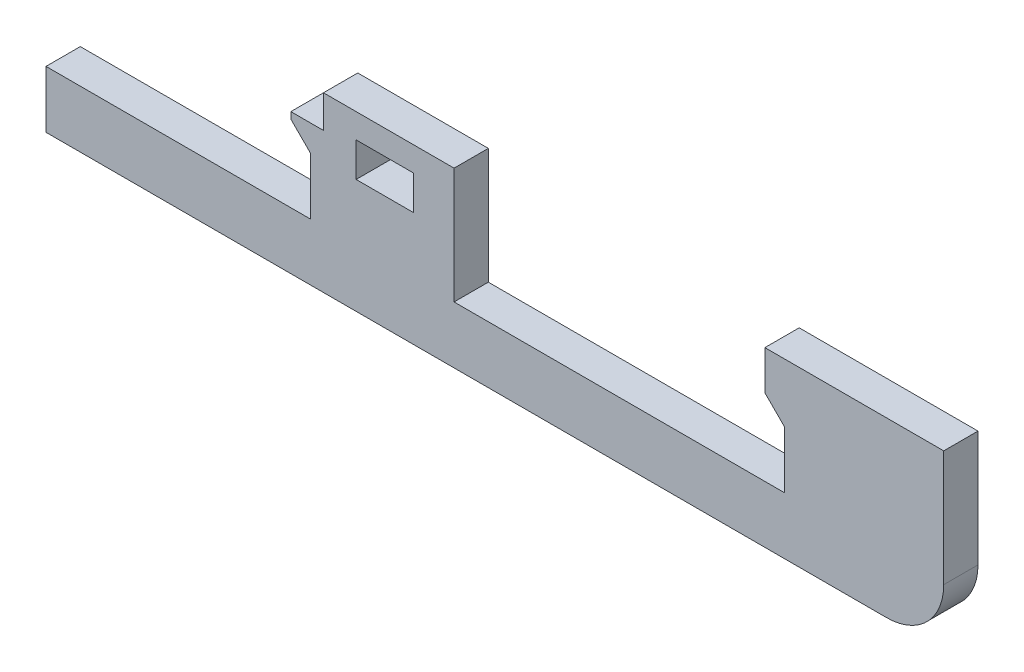
ISO-10303-21;
HEADER;
FILE_DESCRIPTION(('STEP AP214'),'2;1');
FILE_NAME('part.step','',(''),(''),'','','');
FILE_SCHEMA(('AUTOMOTIVE_DESIGN { 1 0 10303 214 1 1 1 1 }'));
ENDSEC;
DATA;
#1=APPLICATION_CONTEXT('core data for automotive mechanical design processes');
#2=APPLICATION_PROTOCOL_DEFINITION('international standard','automotive_design',2000,#1);
#3=PRODUCT_CONTEXT('',#1,'mechanical');
#4=PRODUCT('Part','Part','',(#3));
#5=PRODUCT_RELATED_PRODUCT_CATEGORY('part','',(#4));
#6=PRODUCT_DEFINITION_FORMATION('','',#4);
#7=PRODUCT_DEFINITION_CONTEXT('part definition',#1,'design');
#8=PRODUCT_DEFINITION('design','',#6,#7);
#9=PRODUCT_DEFINITION_SHAPE('','',#8);
#10=(LENGTH_UNIT() NAMED_UNIT(*) SI_UNIT(.MILLI.,.METRE.));
#11=(NAMED_UNIT(*) PLANE_ANGLE_UNIT() SI_UNIT($,.RADIAN.));
#12=(NAMED_UNIT(*) SI_UNIT($,.STERADIAN.) SOLID_ANGLE_UNIT());
#13=UNCERTAINTY_MEASURE_WITH_UNIT(LENGTH_MEASURE(1.E-05),#10,'distance_accuracy_value','');
#14=(GEOMETRIC_REPRESENTATION_CONTEXT(3) GLOBAL_UNCERTAINTY_ASSIGNED_CONTEXT((#13)) GLOBAL_UNIT_ASSIGNED_CONTEXT((#10,
#11,#12)) REPRESENTATION_CONTEXT('',''));
#15=CARTESIAN_POINT('',(0.,0.,0.));
#16=DIRECTION('',(0.,0.,1.));
#17=DIRECTION('',(1.,0.,0.));
#18=AXIS2_PLACEMENT_3D('',#15,#16,#17);
#19=CARTESIAN_POINT('',(0.,0.,5.334));
#20=DIRECTION('',(0.,0.,1.));
#21=DIRECTION('',(1.,0.,0.));
#22=AXIS2_PLACEMENT_3D('',#19,#20,#21);
#23=PLANE('',#22);
#24=DIRECTION('',(0.,1.,0.));
#25=VECTOR('',#24,1.);
#26=CARTESIAN_POINT('',(19.4203051139397,9.6947046579564,5.334));
#27=LINE('',#26,#25);
#28=CARTESIAN_POINT('',(19.4203051139397,9.6947046579564,5.334));
#29=VERTEX_POINT('',#28);
#30=CARTESIAN_POINT('',(19.4203051139397,15.0287046579564,5.334));
#31=VERTEX_POINT('',#30);
#32=EDGE_CURVE('E50',#29,#31,#27,.T.);
#33=ORIENTED_EDGE('',*,*,#32,.F.);
#34=DIRECTION('',(1.,0.,0.));
#35=VECTOR('',#34,1.);
#36=CARTESIAN_POINT('',(19.4203051139397,9.6947046579564,5.334));
#37=LINE('',#36,#35);
#38=CARTESIAN_POINT('',(10.5303051139397,9.6947046579564,5.334));
#39=VERTEX_POINT('',#38);
#40=EDGE_CURVE('E235',#39,#29,#37,.T.);
#41=ORIENTED_EDGE('',*,*,#40,.F.);
#42=DIRECTION('',(0.,-1.,0.));
#43=VECTOR('',#42,1.);
#44=CARTESIAN_POINT('',(10.5303051139397,9.6947046579564,5.334));
#45=LINE('',#44,#43);
#46=CARTESIAN_POINT('',(10.5303051139397,15.0287046579564,5.334));
#47=VERTEX_POINT('',#46);
#48=EDGE_CURVE('E247',#47,#39,#45,.T.);
#49=ORIENTED_EDGE('',*,*,#48,.F.);
#50=DIRECTION('',(-1.,0.,0.));
#51=VECTOR('',#50,1.);
#52=CARTESIAN_POINT('',(19.4203051139397,15.0287046579564,5.334));
#53=LINE('',#52,#51);
#54=EDGE_CURVE('E244',#31,#47,#53,.T.);
#55=ORIENTED_EDGE('',*,*,#54,.F.);
#56=EDGE_LOOP('',(#33,#41,#49,#55));
#57=FACE_BOUND('',#56,.T.);
#58=DIRECTION('',(0.,1.,0.));
#59=VECTOR('',#58,1.);
#60=CARTESIAN_POINT('',(3.41830511393973,4.36070465795646,5.334));
#61=LINE('',#60,#59);
#62=CARTESIAN_POINT('',(3.41830511393973,0.804704657955502,5.334));
#63=VERTEX_POINT('',#62);
#64=CARTESIAN_POINT('',(3.41830511393973,9.69470465795643,5.334));
#65=VERTEX_POINT('',#64);
#66=EDGE_CURVE('E191',#63,#65,#61,.T.);
#67=ORIENTED_EDGE('',*,*,#66,.F.);
#68=DIRECTION('',(1.,0.,0.));
#69=VECTOR('',#68,1.);
#70=CARTESIAN_POINT('',(-37.7296948860603,0.804704657955502,5.334));
#71=LINE('',#70,#69);
#72=CARTESIAN_POINT('',(-37.7296948860603,0.804704657955502,5.334));
#73=VERTEX_POINT('',#72);
#74=EDGE_CURVE('E177',#73,#63,#71,.T.);
#75=ORIENTED_EDGE('',*,*,#74,.F.);
#76=DIRECTION('',(0.,-1.,0.));
#77=VECTOR('',#76,1.);
#78=CARTESIAN_POINT('',(-37.7296948860603,18.8387046579555,5.334));
#79=LINE('',#78,#77);
#80=CARTESIAN_POINT('',(-37.7296948860603,-8.0852953420445,5.334));
#81=VERTEX_POINT('',#80);
#82=EDGE_CURVE('E305',#73,#81,#79,.T.);
#83=ORIENTED_EDGE('',*,*,#82,.T.);
#84=DIRECTION('',(1.,0.,0.));
#85=VECTOR('',#84,1.);
#86=CARTESIAN_POINT('',(-37.7296948860603,-8.0852953420445,5.334));
#87=LINE('',#86,#85);
#88=CARTESIAN_POINT('',(93.0803051139397,-8.0852953420445,5.334));
#89=VERTEX_POINT('',#88);
#90=EDGE_CURVE('E307',#81,#89,#87,.T.);
#91=ORIENTED_EDGE('',*,*,#90,.T.);
#92=CARTESIAN_POINT('',(93.0803051139397,0.804704657955502,5.334));
#93=DIRECTION('',(0.,0.,1.));
#94=DIRECTION('',(1.,0.,0.));
#95=AXIS2_PLACEMENT_3D('',#92,#93,#94);
#96=CIRCLE('',#95,8.89);
#97=CARTESIAN_POINT('',(101.97030511394,0.804704657955506,5.334));
#98=VERTEX_POINT('',#97);
#99=EDGE_CURVE('E11',#89,#98,#96,.T.);
#100=ORIENTED_EDGE('',*,*,#99,.T.);
#101=DIRECTION('',(0.,1.,0.));
#102=VECTOR('',#101,1.);
#103=CARTESIAN_POINT('',(101.97030511394,18.8387046579555,5.334));
#104=LINE('',#103,#102);
#105=CARTESIAN_POINT('',(101.97030511394,18.8387046579555,5.334));
#106=VERTEX_POINT('',#105);
#107=EDGE_CURVE('E311',#98,#106,#104,.T.);
#108=ORIENTED_EDGE('',*,*,#107,.T.);
#109=DIRECTION('',(-1.,0.,0.));
#110=VECTOR('',#109,1.);
#111=CARTESIAN_POINT('',(-37.7296948860603,18.8387046579555,5.334));
#112=LINE('',#111,#110);
#113=CARTESIAN_POINT('',(74.1420651139397,18.8387046579555,5.334));
#114=VERTEX_POINT('',#113);
#115=EDGE_CURVE('E314',#106,#114,#112,.T.);
#116=ORIENTED_EDGE('',*,*,#115,.T.);
#117=DIRECTION('',(0.,1.,0.));
#118=VECTOR('',#117,1.);
#119=CARTESIAN_POINT('',(74.1420651139397,18.8387046579555,5.334));
#120=LINE('',#119,#118);
#121=CARTESIAN_POINT('',(74.1420651139397,12.7427046579555,5.334));
#122=VERTEX_POINT('',#121);
#123=EDGE_CURVE('E283',#122,#114,#120,.T.);
#124=ORIENTED_EDGE('',*,*,#123,.F.);
#125=DIRECTION('',(-0.707106781186552,0.707106781186543,0.));
#126=VECTOR('',#125,1.);
#127=CARTESIAN_POINT('',(77.1900651139397,9.69470465795551,5.334));
#128=LINE('',#127,#126);
#129=CARTESIAN_POINT('',(77.1900651139397,9.69470465795551,5.334));
#130=VERTEX_POINT('',#129);
#131=EDGE_CURVE('E211',#130,#122,#128,.T.);
#132=ORIENTED_EDGE('',*,*,#131,.F.);
#133=DIRECTION('',(0.,1.,0.));
#134=VECTOR('',#133,1.);
#135=CARTESIAN_POINT('',(77.1900651139397,0.804704657955502,5.334));
#136=LINE('',#135,#134);
#137=CARTESIAN_POINT('',(77.1900651139397,0.804704657955502,5.334));
#138=VERTEX_POINT('',#137);
#139=EDGE_CURVE('E220',#138,#130,#136,.T.);
#140=ORIENTED_EDGE('',*,*,#139,.F.);
#141=DIRECTION('',(1.,0.,0.));
#142=VECTOR('',#141,1.);
#143=CARTESIAN_POINT('',(25.7703051139397,0.804704657955502,5.334));
#144=LINE('',#143,#142);
#145=CARTESIAN_POINT('',(25.7703051139397,0.804704657955502,5.334));
#146=VERTEX_POINT('',#145);
#147=EDGE_CURVE('E290',#146,#138,#144,.T.);
#148=ORIENTED_EDGE('',*,*,#147,.F.);
#149=DIRECTION('',(0.,-1.,0.));
#150=VECTOR('',#149,1.);
#151=CARTESIAN_POINT('',(25.7703051139397,18.8387046579555,5.334));
#152=LINE('',#151,#150);
#153=CARTESIAN_POINT('',(25.7703051139397,18.8387046579555,5.334));
#154=VERTEX_POINT('',#153);
#155=EDGE_CURVE('E274',#154,#146,#152,.T.);
#156=ORIENTED_EDGE('',*,*,#155,.F.);
#157=CARTESIAN_POINT('',(5.45030511393973,18.8387046579555,5.334));
#158=VERTEX_POINT('',#157);
#159=EDGE_CURVE('E313',#154,#158,#112,.T.);
#160=ORIENTED_EDGE('',*,*,#159,.T.);
#161=DIRECTION('',(0.,1.,0.));
#162=VECTOR('',#161,1.);
#163=CARTESIAN_POINT('',(5.45030511393973,18.8387046579555,5.334));
#164=LINE('',#163,#162);
#165=CARTESIAN_POINT('',(5.45030511393973,13.7587046579555,5.334));
#166=VERTEX_POINT('',#165);
#167=EDGE_CURVE('E264',#166,#158,#164,.T.);
#168=ORIENTED_EDGE('',*,*,#167,.F.);
#169=DIRECTION('',(1.,0.,0.));
#170=VECTOR('',#169,1.);
#171=CARTESIAN_POINT('',(0.370305113939728,13.7587046579555,5.334));
#172=LINE('',#171,#170);
#173=CARTESIAN_POINT('',(0.370305113939728,13.7587046579555,5.334));
#174=VERTEX_POINT('',#173);
#175=EDGE_CURVE('E254',#174,#166,#172,.T.);
#176=ORIENTED_EDGE('',*,*,#175,.F.);
#177=DIRECTION('',(0.,1.,0.));
#178=VECTOR('',#177,1.);
#179=CARTESIAN_POINT('',(0.370305113939727,18.8387046579555,5.334));
#180=LINE('',#179,#178);
#181=CARTESIAN_POINT('',(0.370305113939728,12.7427046579564,5.334));
#182=VERTEX_POINT('',#181);
#183=EDGE_CURVE('E186',#182,#174,#180,.T.);
#184=ORIENTED_EDGE('',*,*,#183,.F.);
#185=DIRECTION('',(-0.707106781186549,0.707106781186546,0.));
#186=VECTOR('',#185,1.);
#187=CARTESIAN_POINT('',(3.41830511393973,9.69470465795643,5.334));
#188=LINE('',#187,#186);
#189=EDGE_CURVE('E193',#65,#182,#188,.T.);
#190=ORIENTED_EDGE('',*,*,#189,.F.);
#191=EDGE_LOOP('',(#67,#75,#83,#91,#100,#108,#116,#124,#132,#140,#148,#156,#160,#168,#176,#184,#190));
#192=FACE_BOUND('',#191,.T.);
#193=ADVANCED_FACE('F35',(#57,#192),#23,.T.);
#194=CARTESIAN_POINT('',(0.,0.,0.));
#195=DIRECTION('',(0.,0.,1.));
#196=DIRECTION('',(1.,0.,0.));
#197=AXIS2_PLACEMENT_3D('',#194,#195,#196);
#198=PLANE('',#197);
#199=DIRECTION('',(1.,0.,0.));
#200=VECTOR('',#199,1.);
#201=CARTESIAN_POINT('',(19.4203051139397,9.6947046579564,0.));
#202=LINE('',#201,#200);
#203=CARTESIAN_POINT('',(10.5303051139397,9.6947046579564,0.));
#204=VERTEX_POINT('',#203);
#205=CARTESIAN_POINT('',(19.4203051139397,9.6947046579564,0.));
#206=VERTEX_POINT('',#205);
#207=EDGE_CURVE('E239',#204,#206,#202,.T.);
#208=ORIENTED_EDGE('',*,*,#207,.T.);
#209=DIRECTION('',(0.,1.,0.));
#210=VECTOR('',#209,1.);
#211=CARTESIAN_POINT('',(19.4203051139397,9.6947046579564,0.));
#212=LINE('',#211,#210);
#213=CARTESIAN_POINT('',(19.4203051139397,15.0287046579564,0.));
#214=VERTEX_POINT('',#213);
#215=EDGE_CURVE('E231',#206,#214,#212,.T.);
#216=ORIENTED_EDGE('',*,*,#215,.T.);
#217=DIRECTION('',(-1.,0.,0.));
#218=VECTOR('',#217,1.);
#219=CARTESIAN_POINT('',(19.4203051139397,15.0287046579564,0.));
#220=LINE('',#219,#218);
#221=CARTESIAN_POINT('',(10.5303051139397,15.0287046579564,0.));
#222=VERTEX_POINT('',#221);
#223=EDGE_CURVE('E234',#214,#222,#220,.T.);
#224=ORIENTED_EDGE('',*,*,#223,.T.);
#225=DIRECTION('',(0.,-1.,0.));
#226=VECTOR('',#225,1.);
#227=CARTESIAN_POINT('',(10.5303051139397,9.6947046579564,0.));
#228=LINE('',#227,#226);
#229=EDGE_CURVE('E58',#222,#204,#228,.T.);
#230=ORIENTED_EDGE('',*,*,#229,.T.);
#231=EDGE_LOOP('',(#208,#216,#224,#230));
#232=FACE_BOUND('',#231,.T.);
#233=DIRECTION('',(1.,0.,0.));
#234=VECTOR('',#233,1.);
#235=CARTESIAN_POINT('',(-37.7296948860603,0.804704657955502,0.));
#236=LINE('',#235,#234);
#237=CARTESIAN_POINT('',(-37.7296948860603,0.804704657955502,0.));
#238=VERTEX_POINT('',#237);
#239=CARTESIAN_POINT('',(3.41830511393973,0.804704657955502,0.));
#240=VERTEX_POINT('',#239);
#241=EDGE_CURVE('E298',#238,#240,#236,.T.);
#242=ORIENTED_EDGE('',*,*,#241,.T.);
#243=DIRECTION('',(0.,1.,0.));
#244=VECTOR('',#243,1.);
#245=CARTESIAN_POINT('',(3.41830511393973,4.36070465795646,0.));
#246=LINE('',#245,#244);
#247=CARTESIAN_POINT('',(3.41830511393973,9.69470465795643,0.));
#248=VERTEX_POINT('',#247);
#249=EDGE_CURVE('E199',#240,#248,#246,.T.);
#250=ORIENTED_EDGE('',*,*,#249,.T.);
#251=DIRECTION('',(-0.707106781186549,0.707106781186546,0.));
#252=VECTOR('',#251,1.);
#253=CARTESIAN_POINT('',(3.41830511393973,9.69470465795643,0.));
#254=LINE('',#253,#252);
#255=CARTESIAN_POINT('',(0.370305113939728,12.7427046579564,0.));
#256=VERTEX_POINT('',#255);
#257=EDGE_CURVE('E203',#248,#256,#254,.T.);
#258=ORIENTED_EDGE('',*,*,#257,.T.);
#259=DIRECTION('',(0.,1.,0.));
#260=VECTOR('',#259,1.);
#261=CARTESIAN_POINT('',(0.370305113939727,18.8387046579555,0.));
#262=LINE('',#261,#260);
#263=CARTESIAN_POINT('',(0.370305113939727,13.7587046579555,0.));
#264=VERTEX_POINT('',#263);
#265=EDGE_CURVE('E300',#256,#264,#262,.T.);
#266=ORIENTED_EDGE('',*,*,#265,.T.);
#267=DIRECTION('',(1.,0.,0.));
#268=VECTOR('',#267,1.);
#269=CARTESIAN_POINT('',(0.370305113939728,13.7587046579555,0.));
#270=LINE('',#269,#268);
#271=CARTESIAN_POINT('',(5.45030511393973,13.7587046579555,0.));
#272=VERTEX_POINT('',#271);
#273=EDGE_CURVE('E260',#264,#272,#270,.T.);
#274=ORIENTED_EDGE('',*,*,#273,.T.);
#275=DIRECTION('',(0.,1.,0.));
#276=VECTOR('',#275,1.);
#277=CARTESIAN_POINT('',(5.45030511393973,18.8387046579555,0.));
#278=LINE('',#277,#276);
#279=CARTESIAN_POINT('',(5.45030511393973,18.8387046579555,0.));
#280=VERTEX_POINT('',#279);
#281=EDGE_CURVE('E263',#272,#280,#278,.T.);
#282=ORIENTED_EDGE('',*,*,#281,.T.);
#283=DIRECTION('',(-1.,0.,0.));
#284=VECTOR('',#283,1.);
#285=CARTESIAN_POINT('',(-37.7296948860603,18.8387046579555,0.));
#286=LINE('',#285,#284);
#287=CARTESIAN_POINT('',(25.7703051139397,18.8387046579555,0.));
#288=VERTEX_POINT('',#287);
#289=EDGE_CURVE('E324',#288,#280,#286,.T.);
#290=ORIENTED_EDGE('',*,*,#289,.F.);
#291=DIRECTION('',(0.,-1.,0.));
#292=VECTOR('',#291,1.);
#293=CARTESIAN_POINT('',(25.7703051139397,18.8387046579555,0.));
#294=LINE('',#293,#292);
#295=CARTESIAN_POINT('',(25.7703051139397,0.804704657955502,0.));
#296=VERTEX_POINT('',#295);
#297=EDGE_CURVE('E279',#288,#296,#294,.T.);
#298=ORIENTED_EDGE('',*,*,#297,.T.);
#299=DIRECTION('',(1.,0.,0.));
#300=VECTOR('',#299,1.);
#301=CARTESIAN_POINT('',(25.7703051139397,0.804704657955502,0.));
#302=LINE('',#301,#300);
#303=CARTESIAN_POINT('',(77.1900651139397,0.804704657955502,0.));
#304=VERTEX_POINT('',#303);
#305=EDGE_CURVE('E282',#296,#304,#302,.T.);
#306=ORIENTED_EDGE('',*,*,#305,.T.);
#307=DIRECTION('',(0.,1.,0.));
#308=VECTOR('',#307,1.);
#309=CARTESIAN_POINT('',(77.1900651139397,0.804704657955502,0.));
#310=LINE('',#309,#308);
#311=CARTESIAN_POINT('',(77.1900651139397,9.69470465795551,0.));
#312=VERTEX_POINT('',#311);
#313=EDGE_CURVE('E221',#304,#312,#310,.T.);
#314=ORIENTED_EDGE('',*,*,#313,.T.);
#315=DIRECTION('',(-0.707106781186552,0.707106781186543,0.));
#316=VECTOR('',#315,1.);
#317=CARTESIAN_POINT('',(77.1900651139397,9.69470465795551,0.));
#318=LINE('',#317,#316);
#319=CARTESIAN_POINT('',(74.1420651139397,12.7427046579555,0.));
#320=VERTEX_POINT('',#319);
#321=EDGE_CURVE('E213',#312,#320,#318,.T.);
#322=ORIENTED_EDGE('',*,*,#321,.T.);
#323=DIRECTION('',(0.,1.,0.));
#324=VECTOR('',#323,1.);
#325=CARTESIAN_POINT('',(74.1420651139397,18.8387046579555,0.));
#326=LINE('',#325,#324);
#327=CARTESIAN_POINT('',(74.1420651139397,18.8387046579555,0.));
#328=VERTEX_POINT('',#327);
#329=EDGE_CURVE('E285',#320,#328,#326,.T.);
#330=ORIENTED_EDGE('',*,*,#329,.T.);
#331=CARTESIAN_POINT('',(101.97030511394,18.8387046579555,0.));
#332=VERTEX_POINT('',#331);
#333=EDGE_CURVE('E308',#332,#328,#286,.T.);
#334=ORIENTED_EDGE('',*,*,#333,.F.);
#335=DIRECTION('',(0.,1.,0.));
#336=VECTOR('',#335,1.);
#337=CARTESIAN_POINT('',(101.97030511394,18.8387046579555,0.));
#338=LINE('',#337,#336);
#339=CARTESIAN_POINT('',(101.97030511394,0.804704657955506,0.));
#340=VERTEX_POINT('',#339);
#341=EDGE_CURVE('E322',#340,#332,#338,.T.);
#342=ORIENTED_EDGE('',*,*,#341,.F.);
#343=CARTESIAN_POINT('',(93.0803051139397,0.804704657955502,0.));
#344=DIRECTION('',(0.,0.,1.));
#345=DIRECTION('',(1.,0.,0.));
#346=AXIS2_PLACEMENT_3D('',#343,#344,#345);
#347=CIRCLE('',#346,8.89);
#348=CARTESIAN_POINT('',(93.0803051139397,-8.0852953420445,0.));
#349=VERTEX_POINT('',#348);
#350=EDGE_CURVE('E335',#340,#349,#347,.F.);
#351=ORIENTED_EDGE('',*,*,#350,.T.);
#352=DIRECTION('',(1.,0.,0.));
#353=VECTOR('',#352,1.);
#354=CARTESIAN_POINT('',(-37.7296948860603,-8.0852953420445,0.));
#355=LINE('',#354,#353);
#356=CARTESIAN_POINT('',(-37.7296948860603,-8.0852953420445,0.));
#357=VERTEX_POINT('',#356);
#358=EDGE_CURVE('E319',#357,#349,#355,.T.);
#359=ORIENTED_EDGE('',*,*,#358,.F.);
#360=DIRECTION('',(0.,-1.,0.));
#361=VECTOR('',#360,1.);
#362=CARTESIAN_POINT('',(-37.7296948860603,18.8387046579555,0.));
#363=LINE('',#362,#361);
#364=EDGE_CURVE('E304',#238,#357,#363,.T.);
#365=ORIENTED_EDGE('',*,*,#364,.F.);
#366=EDGE_LOOP('',(#242,#250,#258,#266,#274,#282,#290,#298,#306,#314,#322,#330,#334,#342,#351,
#359,#365));
#367=FACE_BOUND('',#366,.T.);
#368=ADVANCED_FACE('F352',(#232,#367),#198,.F.);
#369=CARTESIAN_POINT('',(0.370305113939727,18.8387046579555,0.));
#370=DIRECTION('',(1.,0.,0.));
#371=DIRECTION('',(0.,0.,-1.));
#372=AXIS2_PLACEMENT_3D('',#369,#370,#371);
#373=PLANE('',#372);
#374=ORIENTED_EDGE('',*,*,#265,.F.);
#375=DIRECTION('',(0.,0.,1.));
#376=VECTOR('',#375,1.);
#377=CARTESIAN_POINT('',(0.370305113939728,12.7427046579564,0.));
#378=LINE('',#377,#376);
#379=EDGE_CURVE('E208',#256,#182,#378,.T.);
#380=ORIENTED_EDGE('',*,*,#379,.T.);
#381=ORIENTED_EDGE('',*,*,#183,.T.);
#382=DIRECTION('',(0.,0.,1.));
#383=VECTOR('',#382,1.);
#384=CARTESIAN_POINT('',(0.370305113939728,13.7587046579555,0.));
#385=LINE('',#384,#383);
#386=EDGE_CURVE('E267',#264,#174,#385,.T.);
#387=ORIENTED_EDGE('',*,*,#386,.F.);
#388=EDGE_LOOP('',(#374,#380,#381,#387));
#389=FACE_BOUND('',#388,.T.);
#390=ADVANCED_FACE('F395',(#389),#373,.F.);
#391=CARTESIAN_POINT('',(-37.7296948860603,18.8387046579555,5.334));
#392=DIRECTION('',(0.,-1.,0.));
#393=DIRECTION('',(0.,0.,-1.));
#394=AXIS2_PLACEMENT_3D('',#391,#392,#393);
#395=PLANE('',#394);
#396=ORIENTED_EDGE('',*,*,#289,.T.);
#397=DIRECTION('',(0.,0.,1.));
#398=VECTOR('',#397,1.);
#399=CARTESIAN_POINT('',(5.45030511393973,18.8387046579555,0.));
#400=LINE('',#399,#398);
#401=EDGE_CURVE('E271',#280,#158,#400,.T.);
#402=ORIENTED_EDGE('',*,*,#401,.T.);
#403=ORIENTED_EDGE('',*,*,#159,.F.);
#404=DIRECTION('',(0.,0.,1.));
#405=VECTOR('',#404,1.);
#406=CARTESIAN_POINT('',(25.7703051139397,18.8387046579555,0.));
#407=LINE('',#406,#405);
#408=EDGE_CURVE('E187',#288,#154,#407,.T.);
#409=ORIENTED_EDGE('',*,*,#408,.F.);
#410=EDGE_LOOP('',(#396,#402,#403,#409));
#411=FACE_BOUND('',#410,.T.);
#412=ADVANCED_FACE('F383',(#411),#395,.F.);
#413=CARTESIAN_POINT('',(-37.7296948860603,18.8387046579555,5.334));
#414=DIRECTION('',(1.,0.,0.));
#415=DIRECTION('',(0.,0.,-1.));
#416=AXIS2_PLACEMENT_3D('',#413,#414,#415);
#417=PLANE('',#416);
#418=ORIENTED_EDGE('',*,*,#82,.F.);
#419=DIRECTION('',(0.,0.,1.));
#420=VECTOR('',#419,1.);
#421=CARTESIAN_POINT('',(-37.7296948860603,0.804704657955502,0.));
#422=LINE('',#421,#420);
#423=EDGE_CURVE('E183',#238,#73,#422,.T.);
#424=ORIENTED_EDGE('',*,*,#423,.F.);
#425=ORIENTED_EDGE('',*,*,#364,.T.);
#426=DIRECTION('',(0.,0.,-1.));
#427=VECTOR('',#426,1.);
#428=CARTESIAN_POINT('',(-37.7296948860603,-8.0852953420445,5.334));
#429=LINE('',#428,#427);
#430=EDGE_CURVE('E329',#81,#357,#429,.T.);
#431=ORIENTED_EDGE('',*,*,#430,.F.);
#432=EDGE_LOOP('',(#418,#424,#425,#431));
#433=FACE_BOUND('',#432,.T.);
#434=ADVANCED_FACE('F401',(#433),#417,.F.);
#435=CARTESIAN_POINT('',(-37.7296948860603,-8.0852953420445,5.334));
#436=DIRECTION('',(0.,1.,0.));
#437=DIRECTION('',(0.,0.,1.));
#438=AXIS2_PLACEMENT_3D('',#435,#436,#437);
#439=PLANE('',#438);
#440=ORIENTED_EDGE('',*,*,#358,.T.);
#441=DIRECTION('',(0.,0.,-1.));
#442=VECTOR('',#441,1.);
#443=CARTESIAN_POINT('',(93.0803051139397,-8.0852953420445,5.334));
#444=LINE('',#443,#442);
#445=EDGE_CURVE('E43',#349,#89,#444,.F.);
#446=ORIENTED_EDGE('',*,*,#445,.T.);
#447=ORIENTED_EDGE('',*,*,#90,.F.);
#448=ORIENTED_EDGE('',*,*,#430,.T.);
#449=EDGE_LOOP('',(#440,#446,#447,#448));
#450=FACE_BOUND('',#449,.T.);
#451=ADVANCED_FACE('F339',(#450),#439,.F.);
#452=CARTESIAN_POINT('',(101.97030511394,18.8387046579555,5.334));
#453=DIRECTION('',(-1.,0.,0.));
#454=DIRECTION('',(0.,-1.,0.));
#455=AXIS2_PLACEMENT_3D('',#452,#453,#454);
#456=PLANE('',#455);
#457=ORIENTED_EDGE('',*,*,#107,.F.);
#458=DIRECTION('',(0.,0.,-1.));
#459=VECTOR('',#458,1.);
#460=CARTESIAN_POINT('',(101.97030511394,0.804704657955499,5.334));
#461=LINE('',#460,#459);
#462=EDGE_CURVE('E332',#98,#340,#461,.T.);
#463=ORIENTED_EDGE('',*,*,#462,.T.);
#464=ORIENTED_EDGE('',*,*,#341,.T.);
#465=DIRECTION('',(0.,0.,-1.));
#466=VECTOR('',#465,1.);
#467=CARTESIAN_POINT('',(101.97030511394,18.8387046579555,5.334));
#468=LINE('',#467,#466);
#469=EDGE_CURVE('E317',#106,#332,#468,.T.);
#470=ORIENTED_EDGE('',*,*,#469,.F.);
#471=EDGE_LOOP('',(#457,#463,#464,#470));
#472=FACE_BOUND('',#471,.T.);
#473=ADVANCED_FACE('F348',(#472),#456,.F.);
#474=ORIENTED_EDGE('',*,*,#333,.T.);
#475=DIRECTION('',(0.,0.,1.));
#476=VECTOR('',#475,1.);
#477=CARTESIAN_POINT('',(74.1420651139397,18.8387046579555,0.));
#478=LINE('',#477,#476);
#479=EDGE_CURVE('E294',#328,#114,#478,.T.);
#480=ORIENTED_EDGE('',*,*,#479,.T.);
#481=ORIENTED_EDGE('',*,*,#115,.F.);
#482=ORIENTED_EDGE('',*,*,#469,.T.);
#483=EDGE_LOOP('',(#474,#480,#481,#482));
#484=FACE_BOUND('',#483,.T.);
#485=ADVANCED_FACE('F356',(#484),#395,.F.);
#486=CARTESIAN_POINT('',(-37.7296948860603,0.804704657955502,0.));
#487=DIRECTION('',(0.,-1.,0.));
#488=DIRECTION('',(0.,0.,-1.));
#489=AXIS2_PLACEMENT_3D('',#486,#487,#488);
#490=PLANE('',#489);
#491=ORIENTED_EDGE('',*,*,#74,.T.);
#492=DIRECTION('',(0.,0.,-1.));
#493=VECTOR('',#492,1.);
#494=CARTESIAN_POINT('',(3.41830511393973,0.804704657955502,189.964994026865));
#495=LINE('',#494,#493);
#496=EDGE_CURVE('E181',#63,#240,#495,.T.);
#497=ORIENTED_EDGE('',*,*,#496,.T.);
#498=ORIENTED_EDGE('',*,*,#241,.F.);
#499=ORIENTED_EDGE('',*,*,#423,.T.);
#500=EDGE_LOOP('',(#491,#497,#498,#499));
#501=FACE_BOUND('',#500,.T.);
#502=ADVANCED_FACE('F179',(#501),#490,.F.);
#503=CARTESIAN_POINT('',(25.7703051139397,18.8387046579555,0.));
#504=DIRECTION('',(-1.,0.,0.));
#505=DIRECTION('',(0.,-1.,0.));
#506=AXIS2_PLACEMENT_3D('',#503,#504,#505);
#507=PLANE('',#506);
#508=ORIENTED_EDGE('',*,*,#155,.T.);
#509=DIRECTION('',(0.,0.,1.));
#510=VECTOR('',#509,1.);
#511=CARTESIAN_POINT('',(25.7703051139397,0.804704657955502,0.));
#512=LINE('',#511,#510);
#513=EDGE_CURVE('E287',#296,#146,#512,.T.);
#514=ORIENTED_EDGE('',*,*,#513,.F.);
#515=ORIENTED_EDGE('',*,*,#297,.F.);
#516=ORIENTED_EDGE('',*,*,#408,.T.);
#517=EDGE_LOOP('',(#508,#514,#515,#516));
#518=FACE_BOUND('',#517,.T.);
#519=ADVANCED_FACE('F378',(#518),#507,.F.);
#520=CARTESIAN_POINT('',(74.1420651139397,18.8387046579555,0.));
#521=DIRECTION('',(1.,0.,0.));
#522=DIRECTION('',(0.,0.,-1.));
#523=AXIS2_PLACEMENT_3D('',#520,#521,#522);
#524=PLANE('',#523);
#525=ORIENTED_EDGE('',*,*,#329,.F.);
#526=DIRECTION('',(0.,0.,1.));
#527=VECTOR('',#526,1.);
#528=CARTESIAN_POINT('',(74.1420651139397,12.7427046579555,0.));
#529=LINE('',#528,#527);
#530=EDGE_CURVE('E216',#320,#122,#529,.T.);
#531=ORIENTED_EDGE('',*,*,#530,.T.);
#532=ORIENTED_EDGE('',*,*,#123,.T.);
#533=ORIENTED_EDGE('',*,*,#479,.F.);
#534=EDGE_LOOP('',(#525,#531,#532,#533));
#535=FACE_BOUND('',#534,.T.);
#536=ADVANCED_FACE('F362',(#535),#524,.F.);
#537=CARTESIAN_POINT('',(25.7703051139397,0.804704657955502,0.));
#538=DIRECTION('',(0.,-1.,0.));
#539=DIRECTION('',(0.,0.,-1.));
#540=AXIS2_PLACEMENT_3D('',#537,#538,#539);
#541=PLANE('',#540);
#542=ORIENTED_EDGE('',*,*,#147,.T.);
#543=DIRECTION('',(0.,0.,1.));
#544=VECTOR('',#543,1.);
#545=CARTESIAN_POINT('',(77.1900651139397,0.804704657955502,0.));
#546=LINE('',#545,#544);
#547=EDGE_CURVE('E224',#304,#138,#546,.T.);
#548=ORIENTED_EDGE('',*,*,#547,.F.);
#549=ORIENTED_EDGE('',*,*,#305,.F.);
#550=ORIENTED_EDGE('',*,*,#513,.T.);
#551=EDGE_LOOP('',(#542,#548,#549,#550));
#552=FACE_BOUND('',#551,.T.);
#553=ADVANCED_FACE('F376',(#552),#541,.F.);
#554=CARTESIAN_POINT('',(5.45030511393973,18.8387046579555,0.));
#555=DIRECTION('',(1.,0.,0.));
#556=DIRECTION('',(0.,0.,-1.));
#557=AXIS2_PLACEMENT_3D('',#554,#555,#556);
#558=PLANE('',#557);
#559=ORIENTED_EDGE('',*,*,#167,.T.);
#560=ORIENTED_EDGE('',*,*,#401,.F.);
#561=ORIENTED_EDGE('',*,*,#281,.F.);
#562=DIRECTION('',(0.,0.,1.));
#563=VECTOR('',#562,1.);
#564=CARTESIAN_POINT('',(5.45030511393973,13.7587046579555,0.));
#565=LINE('',#564,#563);
#566=EDGE_CURVE('E275',#272,#166,#565,.T.);
#567=ORIENTED_EDGE('',*,*,#566,.T.);
#568=EDGE_LOOP('',(#559,#560,#561,#567));
#569=FACE_BOUND('',#568,.T.);
#570=ADVANCED_FACE('F387',(#569),#558,.F.);
#571=CARTESIAN_POINT('',(0.370305113939728,13.7587046579555,0.));
#572=DIRECTION('',(0.,-1.,0.));
#573=DIRECTION('',(0.,0.,-1.));
#574=AXIS2_PLACEMENT_3D('',#571,#572,#573);
#575=PLANE('',#574);
#576=ORIENTED_EDGE('',*,*,#175,.T.);
#577=ORIENTED_EDGE('',*,*,#566,.F.);
#578=ORIENTED_EDGE('',*,*,#273,.F.);
#579=ORIENTED_EDGE('',*,*,#386,.T.);
#580=EDGE_LOOP('',(#576,#577,#578,#579));
#581=FACE_BOUND('',#580,.T.);
#582=ADVANCED_FACE('F391',(#581),#575,.F.);
#583=CARTESIAN_POINT('',(93.0803051139397,0.804704657955502,5.334));
#584=DIRECTION('',(0.,0.,-1.));
#585=DIRECTION('',(-1.,0.,0.));
#586=AXIS2_PLACEMENT_3D('',#583,#584,#585);
#587=CYLINDRICAL_SURFACE('',#586,8.89);
#588=ORIENTED_EDGE('',*,*,#99,.F.);
#589=ORIENTED_EDGE('',*,*,#445,.F.);
#590=ORIENTED_EDGE('',*,*,#350,.F.);
#591=ORIENTED_EDGE('',*,*,#462,.F.);
#592=EDGE_LOOP('',(#588,#589,#590,#591));
#593=FACE_BOUND('',#592,.T.);
#594=ADVANCED_FACE('F37',(#593),#587,.T.);
#595=CARTESIAN_POINT('',(19.4203051139397,9.6947046579564,0.));
#596=DIRECTION('',(1.,0.,0.));
#597=DIRECTION('',(0.,0.,-1.));
#598=AXIS2_PLACEMENT_3D('',#595,#596,#597);
#599=PLANE('',#598);
#600=ORIENTED_EDGE('',*,*,#32,.T.);
#601=DIRECTION('',(0.,0.,1.));
#602=VECTOR('',#601,1.);
#603=CARTESIAN_POINT('',(19.4203051139397,15.0287046579564,0.));
#604=LINE('',#603,#602);
#605=EDGE_CURVE('E242',#214,#31,#604,.T.);
#606=ORIENTED_EDGE('',*,*,#605,.F.);
#607=ORIENTED_EDGE('',*,*,#215,.F.);
#608=DIRECTION('',(0.,0.,1.));
#609=VECTOR('',#608,1.);
#610=CARTESIAN_POINT('',(19.4203051139397,9.6947046579564,0.));
#611=LINE('',#610,#609);
#612=EDGE_CURVE('E252',#206,#29,#611,.T.);
#613=ORIENTED_EDGE('',*,*,#612,.T.);
#614=EDGE_LOOP('',(#600,#606,#607,#613));
#615=FACE_BOUND('',#614,.T.);
#616=ADVANCED_FACE('F476',(#615),#599,.F.);
#617=CARTESIAN_POINT('',(19.4203051139397,9.6947046579564,0.));
#618=DIRECTION('',(0.,-1.,0.));
#619=DIRECTION('',(1.,0.,0.));
#620=AXIS2_PLACEMENT_3D('',#617,#618,#619);
#621=PLANE('',#620);
#622=ORIENTED_EDGE('',*,*,#40,.T.);
#623=ORIENTED_EDGE('',*,*,#612,.F.);
#624=ORIENTED_EDGE('',*,*,#207,.F.);
#625=DIRECTION('',(0.,0.,1.));
#626=VECTOR('',#625,1.);
#627=CARTESIAN_POINT('',(10.5303051139397,9.6947046579564,0.));
#628=LINE('',#627,#626);
#629=EDGE_CURVE('E255',#204,#39,#628,.T.);
#630=ORIENTED_EDGE('',*,*,#629,.T.);
#631=EDGE_LOOP('',(#622,#623,#624,#630));
#632=FACE_BOUND('',#631,.T.);
#633=ADVANCED_FACE('F482',(#632),#621,.F.);
#634=CARTESIAN_POINT('',(10.5303051139397,9.6947046579564,0.));
#635=DIRECTION('',(-1.,0.,0.));
#636=DIRECTION('',(0.,0.,1.));
#637=AXIS2_PLACEMENT_3D('',#634,#635,#636);
#638=PLANE('',#637);
#639=ORIENTED_EDGE('',*,*,#48,.T.);
#640=ORIENTED_EDGE('',*,*,#629,.F.);
#641=ORIENTED_EDGE('',*,*,#229,.F.);
#642=DIRECTION('',(0.,0.,1.));
#643=VECTOR('',#642,1.);
#644=CARTESIAN_POINT('',(10.5303051139397,15.0287046579564,0.));
#645=LINE('',#644,#643);
#646=EDGE_CURVE('E257',#222,#47,#645,.T.);
#647=ORIENTED_EDGE('',*,*,#646,.T.);
#648=EDGE_LOOP('',(#639,#640,#641,#647));
#649=FACE_BOUND('',#648,.T.);
#650=ADVANCED_FACE('F489',(#649),#638,.F.);
#651=CARTESIAN_POINT('',(19.4203051139397,15.0287046579564,0.));
#652=DIRECTION('',(0.,1.,0.));
#653=DIRECTION('',(-1.,0.,0.));
#654=AXIS2_PLACEMENT_3D('',#651,#652,#653);
#655=PLANE('',#654);
#656=ORIENTED_EDGE('',*,*,#54,.T.);
#657=ORIENTED_EDGE('',*,*,#646,.F.);
#658=ORIENTED_EDGE('',*,*,#223,.F.);
#659=ORIENTED_EDGE('',*,*,#605,.T.);
#660=EDGE_LOOP('',(#656,#657,#658,#659));
#661=FACE_BOUND('',#660,.T.);
#662=ADVANCED_FACE('F497',(#661),#655,.F.);
#663=CARTESIAN_POINT('',(77.1900651139397,0.804704657955502,0.));
#664=DIRECTION('',(1.,0.,0.));
#665=DIRECTION('',(0.,0.,-1.));
#666=AXIS2_PLACEMENT_3D('',#663,#664,#665);
#667=PLANE('',#666);
#668=ORIENTED_EDGE('',*,*,#139,.T.);
#669=DIRECTION('',(0.,0.,1.));
#670=VECTOR('',#669,1.);
#671=CARTESIAN_POINT('',(77.1900651139397,9.69470465795551,0.));
#672=LINE('',#671,#670);
#673=EDGE_CURVE('E227',#312,#130,#672,.T.);
#674=ORIENTED_EDGE('',*,*,#673,.F.);
#675=ORIENTED_EDGE('',*,*,#313,.F.);
#676=ORIENTED_EDGE('',*,*,#547,.T.);
#677=EDGE_LOOP('',(#668,#674,#675,#676));
#678=FACE_BOUND('',#677,.T.);
#679=ADVANCED_FACE('F370',(#678),#667,.F.);
#680=CARTESIAN_POINT('',(77.1900651139397,9.69470465795551,0.));
#681=DIRECTION('',(0.707106781186543,0.707106781186552,0.));
#682=DIRECTION('',(-0.707106781186552,0.707106781186543,0.));
#683=AXIS2_PLACEMENT_3D('',#680,#681,#682);
#684=PLANE('',#683);
#685=ORIENTED_EDGE('',*,*,#131,.T.);
#686=ORIENTED_EDGE('',*,*,#530,.F.);
#687=ORIENTED_EDGE('',*,*,#321,.F.);
#688=ORIENTED_EDGE('',*,*,#673,.T.);
#689=EDGE_LOOP('',(#685,#686,#687,#688));
#690=FACE_BOUND('',#689,.T.);
#691=ADVANCED_FACE('F364',(#690),#684,.F.);
#692=CARTESIAN_POINT('',(3.41830511393973,9.69470465795643,0.));
#693=DIRECTION('',(0.707106781186546,0.707106781186549,0.));
#694=DIRECTION('',(-0.707106781186549,0.707106781186546,0.));
#695=AXIS2_PLACEMENT_3D('',#692,#693,#694);
#696=PLANE('',#695);
#697=ORIENTED_EDGE('',*,*,#189,.T.);
#698=ORIENTED_EDGE('',*,*,#379,.F.);
#699=ORIENTED_EDGE('',*,*,#257,.F.);
#700=DIRECTION('',(0.,0.,1.));
#701=VECTOR('',#700,1.);
#702=CARTESIAN_POINT('',(3.41830511393973,9.69470465795643,0.));
#703=LINE('',#702,#701);
#704=EDGE_CURVE('E205',#248,#65,#703,.T.);
#705=ORIENTED_EDGE('',*,*,#704,.T.);
#706=EDGE_LOOP('',(#697,#698,#699,#705));
#707=FACE_BOUND('',#706,.T.);
#708=ADVANCED_FACE('F398',(#707),#696,.F.);
#709=CARTESIAN_POINT('',(3.41830511393973,4.36070465795646,0.));
#710=DIRECTION('',(1.,0.,0.));
#711=DIRECTION('',(0.,0.,-1.));
#712=AXIS2_PLACEMENT_3D('',#709,#710,#711);
#713=PLANE('',#712);
#714=ORIENTED_EDGE('',*,*,#66,.T.);
#715=ORIENTED_EDGE('',*,*,#704,.F.);
#716=ORIENTED_EDGE('',*,*,#249,.F.);
#717=ORIENTED_EDGE('',*,*,#496,.F.);
#718=EDGE_LOOP('',(#714,#715,#716,#717));
#719=FACE_BOUND('',#718,.T.);
#720=ADVANCED_FACE('F197',(#719),#713,.F.);
#721=CLOSED_SHELL('',(#193,#368,#390,#412,#434,#451,#473,#485,#502,#519,#536,#553,#570,#582,
#594,#616,#633,#650,#662,#679,#691,#708,#720));
#722=MANIFOLD_SOLID_BREP('B2',#721);
#723=ADVANCED_BREP_SHAPE_REPRESENTATION('',(#18,#722),#14);
#724=SHAPE_DEFINITION_REPRESENTATION(#9,#723);
ENDSEC;
END-ISO-10303-21;
